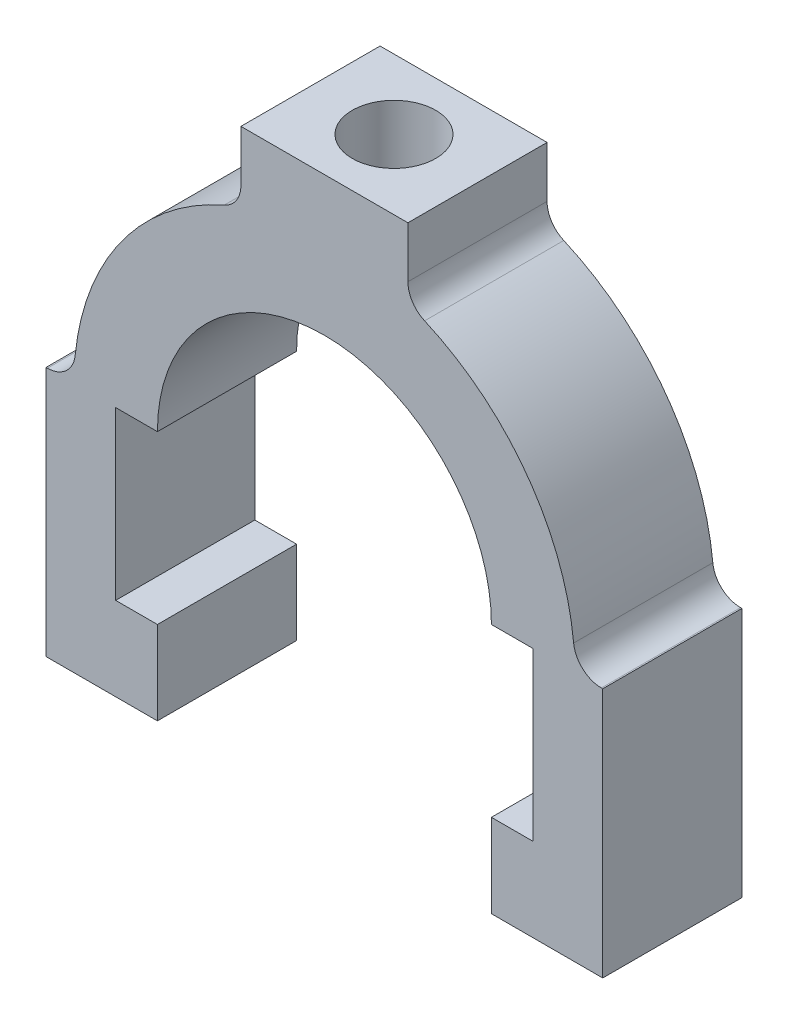
ISO-10303-21;
HEADER;
FILE_DESCRIPTION(('STEP AP214'),'2;1');
FILE_NAME('part.step','',(''),(''),'','','');
FILE_SCHEMA(('AUTOMOTIVE_DESIGN { 1 0 10303 214 1 1 1 1 }'));
ENDSEC;
DATA;
#1=APPLICATION_CONTEXT('core data for automotive mechanical design processes');
#2=APPLICATION_PROTOCOL_DEFINITION('international standard','automotive_design',2000,#1);
#3=PRODUCT_CONTEXT('',#1,'mechanical');
#4=PRODUCT('Part','Part','',(#3));
#5=PRODUCT_RELATED_PRODUCT_CATEGORY('part','',(#4));
#6=PRODUCT_DEFINITION_FORMATION('','',#4);
#7=PRODUCT_DEFINITION_CONTEXT('part definition',#1,'design');
#8=PRODUCT_DEFINITION('design','',#6,#7);
#9=PRODUCT_DEFINITION_SHAPE('','',#8);
#10=(LENGTH_UNIT() NAMED_UNIT(*) SI_UNIT(.MILLI.,.METRE.));
#11=(NAMED_UNIT(*) PLANE_ANGLE_UNIT() SI_UNIT($,.RADIAN.));
#12=(NAMED_UNIT(*) SI_UNIT($,.STERADIAN.) SOLID_ANGLE_UNIT());
#13=UNCERTAINTY_MEASURE_WITH_UNIT(LENGTH_MEASURE(1.E-05),#10,'distance_accuracy_value','');
#14=(GEOMETRIC_REPRESENTATION_CONTEXT(3) GLOBAL_UNCERTAINTY_ASSIGNED_CONTEXT((#13)) GLOBAL_UNIT_ASSIGNED_CONTEXT((#10,
#11,#12)) REPRESENTATION_CONTEXT('',''));
#15=CARTESIAN_POINT('',(0.,0.,0.));
#16=DIRECTION('',(0.,0.,1.));
#17=DIRECTION('',(1.,0.,0.));
#18=AXIS2_PLACEMENT_3D('',#15,#16,#17);
#19=CARTESIAN_POINT('',(0.,36.,10.));
#20=DIRECTION('',(0.,1.,0.));
#21=DIRECTION('',(0.,0.,1.));
#22=AXIS2_PLACEMENT_3D('',#19,#20,#21);
#23=PLANE('',#22);
#24=DIRECTION('',(1.,0.,0.));
#25=VECTOR('',#24,1.);
#26=CARTESIAN_POINT('',(0.,36.,-10.));
#27=LINE('',#26,#25);
#28=CARTESIAN_POINT('',(-16.,36.,-10.));
#29=VERTEX_POINT('',#28);
#30=CARTESIAN_POINT('',(-10.,36.,-10.));
#31=VERTEX_POINT('',#30);
#32=EDGE_CURVE('E230',#29,#31,#27,.T.);
#33=ORIENTED_EDGE('',*,*,#32,.T.);
#34=DIRECTION('',(0.,0.,-1.));
#35=VECTOR('',#34,1.);
#36=CARTESIAN_POINT('',(-10.,36.,10.));
#37=LINE('',#36,#35);
#38=CARTESIAN_POINT('',(-10.,36.,10.));
#39=VERTEX_POINT('',#38);
#40=EDGE_CURVE('E228',#39,#31,#37,.T.);
#41=ORIENTED_EDGE('',*,*,#40,.F.);
#42=DIRECTION('',(1.,0.,0.));
#43=VECTOR('',#42,1.);
#44=CARTESIAN_POINT('',(0.,36.,10.));
#45=LINE('',#44,#43);
#46=CARTESIAN_POINT('',(-16.,36.,10.));
#47=VERTEX_POINT('',#46);
#48=EDGE_CURVE('E212',#47,#39,#45,.T.);
#49=ORIENTED_EDGE('',*,*,#48,.F.);
#50=DIRECTION('',(0.,0.,-1.));
#51=VECTOR('',#50,1.);
#52=CARTESIAN_POINT('',(-16.,36.,10.));
#53=LINE('',#52,#51);
#54=EDGE_CURVE('E282',#47,#29,#53,.T.);
#55=ORIENTED_EDGE('',*,*,#54,.T.);
#56=EDGE_LOOP('',(#33,#41,#49,#55));
#57=FACE_BOUND('',#56,.T.);
#58=ADVANCED_FACE('F45',(#57),#23,.F.);
#59=CARTESIAN_POINT('',(-10.,0.,10.));
#60=DIRECTION('',(-1.,0.,0.));
#61=DIRECTION('',(0.,0.,1.));
#62=AXIS2_PLACEMENT_3D('',#59,#60,#61);
#63=PLANE('',#62);
#64=DIRECTION('',(0.,1.,0.));
#65=VECTOR('',#64,1.);
#66=CARTESIAN_POINT('',(-10.,0.,-10.));
#67=LINE('',#66,#65);
#68=CARTESIAN_POINT('',(-10.,12.,-10.));
#69=VERTEX_POINT('',#68);
#70=EDGE_CURVE('E284',#69,#31,#67,.T.);
#71=ORIENTED_EDGE('',*,*,#70,.F.);
#72=DIRECTION('',(0.,0.,-1.));
#73=VECTOR('',#72,1.);
#74=CARTESIAN_POINT('',(-10.,12.,10.));
#75=LINE('',#74,#73);
#76=CARTESIAN_POINT('',(-10.,12.,10.));
#77=VERTEX_POINT('',#76);
#78=EDGE_CURVE('E235',#77,#69,#75,.T.);
#79=ORIENTED_EDGE('',*,*,#78,.F.);
#80=DIRECTION('',(0.,1.,0.));
#81=VECTOR('',#80,1.);
#82=CARTESIAN_POINT('',(-10.,0.,10.));
#83=LINE('',#82,#81);
#84=EDGE_CURVE('E217',#77,#39,#83,.T.);
#85=ORIENTED_EDGE('',*,*,#84,.T.);
#86=ORIENTED_EDGE('',*,*,#40,.T.);
#87=EDGE_LOOP('',(#71,#79,#85,#86));
#88=FACE_BOUND('',#87,.T.);
#89=ADVANCED_FACE('F237',(#88),#63,.T.);
#90=CARTESIAN_POINT('',(0.,12.,10.));
#91=DIRECTION('',(0.,1.,0.));
#92=DIRECTION('',(0.,0.,1.));
#93=AXIS2_PLACEMENT_3D('',#90,#91,#92);
#94=PLANE('',#93);
#95=DIRECTION('',(1.,0.,0.));
#96=VECTOR('',#95,1.);
#97=CARTESIAN_POINT('',(0.,12.,-10.));
#98=LINE('',#97,#96);
#99=CARTESIAN_POINT('',(-16.,12.,-10.));
#100=VERTEX_POINT('',#99);
#101=EDGE_CURVE('E286',#100,#69,#98,.T.);
#102=ORIENTED_EDGE('',*,*,#101,.F.);
#103=DIRECTION('',(0.,0.,-1.));
#104=VECTOR('',#103,1.);
#105=CARTESIAN_POINT('',(-16.,12.,10.));
#106=LINE('',#105,#104);
#107=CARTESIAN_POINT('',(-16.,12.,10.));
#108=VERTEX_POINT('',#107);
#109=EDGE_CURVE('E359',#108,#100,#106,.T.);
#110=ORIENTED_EDGE('',*,*,#109,.F.);
#111=DIRECTION('',(1.,0.,0.));
#112=VECTOR('',#111,1.);
#113=CARTESIAN_POINT('',(0.,12.,10.));
#114=LINE('',#113,#112);
#115=EDGE_CURVE('E238',#108,#77,#114,.T.);
#116=ORIENTED_EDGE('',*,*,#115,.T.);
#117=ORIENTED_EDGE('',*,*,#78,.T.);
#118=EDGE_LOOP('',(#102,#110,#116,#117));
#119=FACE_BOUND('',#118,.T.);
#120=ADVANCED_FACE('F456',(#119),#94,.T.);
#121=CARTESIAN_POINT('',(-16.,0.,10.));
#122=DIRECTION('',(-1.,0.,0.));
#123=DIRECTION('',(0.,0.,1.));
#124=AXIS2_PLACEMENT_3D('',#121,#122,#123);
#125=PLANE('',#124);
#126=DIRECTION('',(0.,1.,0.));
#127=VECTOR('',#126,1.);
#128=CARTESIAN_POINT('',(-16.,0.,-10.));
#129=LINE('',#128,#127);
#130=CARTESIAN_POINT('',(-16.,0.,-10.));
#131=VERTEX_POINT('',#130);
#132=EDGE_CURVE('E289',#131,#100,#129,.T.);
#133=ORIENTED_EDGE('',*,*,#132,.F.);
#134=DIRECTION('',(0.,0.,-1.));
#135=VECTOR('',#134,1.);
#136=CARTESIAN_POINT('',(-16.,0.,10.));
#137=LINE('',#136,#135);
#138=CARTESIAN_POINT('',(-16.,0.,10.));
#139=VERTEX_POINT('',#138);
#140=EDGE_CURVE('E357',#139,#131,#137,.T.);
#141=ORIENTED_EDGE('',*,*,#140,.F.);
#142=DIRECTION('',(0.,1.,0.));
#143=VECTOR('',#142,1.);
#144=CARTESIAN_POINT('',(-16.,0.,10.));
#145=LINE('',#144,#143);
#146=EDGE_CURVE('E240',#139,#108,#145,.T.);
#147=ORIENTED_EDGE('',*,*,#146,.T.);
#148=ORIENTED_EDGE('',*,*,#109,.T.);
#149=EDGE_LOOP('',(#133,#141,#147,#148));
#150=FACE_BOUND('',#149,.T.);
#151=ADVANCED_FACE('F453',(#150),#125,.T.);
#152=CARTESIAN_POINT('',(0.,0.,10.));
#153=DIRECTION('',(0.,-1.,0.));
#154=DIRECTION('',(1.,0.,0.));
#155=AXIS2_PLACEMENT_3D('',#152,#153,#154);
#156=PLANE('',#155);
#157=DIRECTION('',(-1.,0.,0.));
#158=VECTOR('',#157,1.);
#159=CARTESIAN_POINT('',(0.,0.,-10.));
#160=LINE('',#159,#158);
#161=CARTESIAN_POINT('',(0.,0.,-10.));
#162=VERTEX_POINT('',#161);
#163=EDGE_CURVE('E292',#162,#131,#160,.T.);
#164=ORIENTED_EDGE('',*,*,#163,.F.);
#165=DIRECTION('',(0.,0.,-1.));
#166=VECTOR('',#165,1.);
#167=CARTESIAN_POINT('',(0.,0.,10.));
#168=LINE('',#167,#166);
#169=CARTESIAN_POINT('',(0.,0.,10.));
#170=VERTEX_POINT('',#169);
#171=EDGE_CURVE('E355',#170,#162,#168,.T.);
#172=ORIENTED_EDGE('',*,*,#171,.F.);
#173=DIRECTION('',(-1.,0.,0.));
#174=VECTOR('',#173,1.);
#175=CARTESIAN_POINT('',(0.,0.,10.));
#176=LINE('',#175,#174);
#177=EDGE_CURVE('E246',#170,#139,#176,.T.);
#178=ORIENTED_EDGE('',*,*,#177,.T.);
#179=ORIENTED_EDGE('',*,*,#140,.T.);
#180=EDGE_LOOP('',(#164,#172,#178,#179));
#181=FACE_BOUND('',#180,.T.);
#182=ADVANCED_FACE('F448',(#181),#156,.T.);
#183=CARTESIAN_POINT('',(0.,0.,10.));
#184=DIRECTION('',(-1.,0.,0.));
#185=DIRECTION('',(0.,0.,1.));
#186=AXIS2_PLACEMENT_3D('',#183,#184,#185);
#187=PLANE('',#186);
#188=DIRECTION('',(0.,1.,0.));
#189=VECTOR('',#188,1.);
#190=CARTESIAN_POINT('',(0.,0.,-10.));
#191=LINE('',#190,#189);
#192=CARTESIAN_POINT('',(0.,36.,-10.));
#193=VERTEX_POINT('',#192);
#194=EDGE_CURVE('E295',#162,#193,#191,.T.);
#195=ORIENTED_EDGE('',*,*,#194,.T.);
#196=DIRECTION('',(0.,0.,-1.));
#197=VECTOR('',#196,1.);
#198=CARTESIAN_POINT('',(0.,36.,10.));
#199=LINE('',#198,#197);
#200=CARTESIAN_POINT('',(0.,36.,10.));
#201=VERTEX_POINT('',#200);
#202=EDGE_CURVE('E352',#201,#193,#199,.T.);
#203=ORIENTED_EDGE('',*,*,#202,.F.);
#204=DIRECTION('',(0.,1.,0.));
#205=VECTOR('',#204,1.);
#206=CARTESIAN_POINT('',(0.,0.,10.));
#207=LINE('',#206,#205);
#208=EDGE_CURVE('E249',#170,#201,#207,.T.);
#209=ORIENTED_EDGE('',*,*,#208,.F.);
#210=ORIENTED_EDGE('',*,*,#171,.T.);
#211=EDGE_LOOP('',(#195,#203,#209,#210));
#212=FACE_BOUND('',#211,.T.);
#213=ADVANCED_FACE('F445',(#212),#187,.F.);
#214=CARTESIAN_POINT('',(0.,36.,10.));
#215=DIRECTION('',(0.,1.,0.));
#216=DIRECTION('',(0.,0.,1.));
#217=AXIS2_PLACEMENT_3D('',#214,#215,#216);
#218=PLANE('',#217);
#219=DIRECTION('',(1.,0.,0.));
#220=VECTOR('',#219,1.);
#221=CARTESIAN_POINT('',(0.,36.,-10.));
#222=LINE('',#221,#220);
#223=CARTESIAN_POINT('',(-0.200502515735196,36.,-10.));
#224=VERTEX_POINT('',#223);
#225=EDGE_CURVE('E298',#224,#193,#222,.T.);
#226=ORIENTED_EDGE('',*,*,#225,.F.);
#227=DIRECTION('',(0.,0.,-1.));
#228=VECTOR('',#227,1.);
#229=CARTESIAN_POINT('',(-0.200502515735196,36.,10.));
#230=LINE('',#229,#228);
#231=CARTESIAN_POINT('',(-0.200502515735196,36.,10.));
#232=VERTEX_POINT('',#231);
#233=EDGE_CURVE('E375',#224,#232,#230,.F.);
#234=ORIENTED_EDGE('',*,*,#233,.T.);
#235=DIRECTION('',(1.,0.,0.));
#236=VECTOR('',#235,1.);
#237=CARTESIAN_POINT('',(0.,36.,10.));
#238=LINE('',#237,#236);
#239=EDGE_CURVE('E252',#232,#201,#238,.T.);
#240=ORIENTED_EDGE('',*,*,#239,.T.);
#241=ORIENTED_EDGE('',*,*,#202,.T.);
#242=EDGE_LOOP('',(#226,#234,#240,#241));
#243=FACE_BOUND('',#242,.T.);
#244=ADVANCED_FACE('F440',(#243),#218,.T.);
#245=CARTESIAN_POINT('',(-40.,36.,10.));
#246=DIRECTION('',(0.,0.,-1.));
#247=DIRECTION('',(-1.,0.,0.));
#248=AXIS2_PLACEMENT_3D('',#245,#246,#247);
#249=CYLINDRICAL_SURFACE('',#248,36.);
#250=CARTESIAN_POINT('',(-40.,36.,10.));
#251=DIRECTION('',(0.,0.,1.));
#252=DIRECTION('',(1.,0.,0.));
#253=AXIS2_PLACEMENT_3D('',#250,#251,#252);
#254=CIRCLE('',#253,36.);
#255=CARTESIAN_POINT('',(-4.18045226416168,39.6,10.));
#256=VERTEX_POINT('',#255);
#257=CARTESIAN_POINT('',(-25.6,68.994545003682,10.));
#258=VERTEX_POINT('',#257);
#259=EDGE_CURVE('E254',#256,#258,#254,.T.);
#260=ORIENTED_EDGE('',*,*,#259,.F.);
#261=DIRECTION('',(0.,0.,-1.));
#262=VECTOR('',#261,1.);
#263=CARTESIAN_POINT('',(-4.18045226416168,39.6,10.));
#264=LINE('',#263,#262);
#265=CARTESIAN_POINT('',(-4.18045226416168,39.6,-10.));
#266=VERTEX_POINT('',#265);
#267=EDGE_CURVE('E372',#256,#266,#264,.T.);
#268=ORIENTED_EDGE('',*,*,#267,.T.);
#269=CARTESIAN_POINT('',(-40.,36.,-10.));
#270=DIRECTION('',(0.,0.,1.));
#271=DIRECTION('',(1.,0.,0.));
#272=AXIS2_PLACEMENT_3D('',#269,#270,#271);
#273=CIRCLE('',#272,36.);
#274=CARTESIAN_POINT('',(-25.6,68.994545003682,-10.));
#275=VERTEX_POINT('',#274);
#276=EDGE_CURVE('E300',#266,#275,#273,.T.);
#277=ORIENTED_EDGE('',*,*,#276,.T.);
#278=DIRECTION('',(0.,0.,-1.));
#279=VECTOR('',#278,1.);
#280=CARTESIAN_POINT('',(-25.6,68.994545003682,10.));
#281=LINE('',#280,#279);
#282=EDGE_CURVE('E364',#275,#258,#281,.F.);
#283=ORIENTED_EDGE('',*,*,#282,.T.);
#284=EDGE_LOOP('',(#260,#268,#277,#283));
#285=FACE_BOUND('',#284,.T.);
#286=ADVANCED_FACE('F431',(#285),#249,.T.);
#287=CARTESIAN_POINT('',(-28.,0.,10.));
#288=DIRECTION('',(1.,0.,0.));
#289=DIRECTION('',(0.,1.,0.));
#290=AXIS2_PLACEMENT_3D('',#287,#288,#289);
#291=PLANE('',#290);
#292=DIRECTION('',(0.,-1.,0.));
#293=VECTOR('',#292,1.);
#294=CARTESIAN_POINT('',(-28.,0.,10.));
#295=LINE('',#294,#293);
#296=CARTESIAN_POINT('',(-28.,80.,10.));
#297=VERTEX_POINT('',#296);
#298=CARTESIAN_POINT('',(-28.,72.6606055596467,10.));
#299=VERTEX_POINT('',#298);
#300=EDGE_CURVE('E256',#297,#299,#295,.T.);
#301=ORIENTED_EDGE('',*,*,#300,.T.);
#302=DIRECTION('',(0.,0.,-1.));
#303=VECTOR('',#302,1.);
#304=CARTESIAN_POINT('',(-28.,72.6606055596467,10.));
#305=LINE('',#304,#303);
#306=CARTESIAN_POINT('',(-28.,72.6606055596467,-10.));
#307=VERTEX_POINT('',#306);
#308=EDGE_CURVE('E234',#299,#307,#305,.T.);
#309=ORIENTED_EDGE('',*,*,#308,.T.);
#310=DIRECTION('',(0.,-1.,0.));
#311=VECTOR('',#310,1.);
#312=CARTESIAN_POINT('',(-28.,0.,-10.));
#313=LINE('',#312,#311);
#314=CARTESIAN_POINT('',(-28.,80.,-10.));
#315=VERTEX_POINT('',#314);
#316=EDGE_CURVE('E302',#315,#307,#313,.T.);
#317=ORIENTED_EDGE('',*,*,#316,.F.);
#318=DIRECTION('',(0.,0.,-1.));
#319=VECTOR('',#318,1.);
#320=CARTESIAN_POINT('',(-28.,80.,10.));
#321=LINE('',#320,#319);
#322=EDGE_CURVE('E350',#297,#315,#321,.T.);
#323=ORIENTED_EDGE('',*,*,#322,.F.);
#324=EDGE_LOOP('',(#301,#309,#317,#323));
#325=FACE_BOUND('',#324,.T.);
#326=ADVANCED_FACE('F422',(#325),#291,.T.);
#327=CARTESIAN_POINT('',(0.,80.,10.));
#328=DIRECTION('',(0.,1.,0.));
#329=DIRECTION('',(-1.,0.,0.));
#330=AXIS2_PLACEMENT_3D('',#327,#328,#329);
#331=PLANE('',#330);
#332=CARTESIAN_POINT('',(-40.,80.,0.));
#333=DIRECTION('',(0.,1.,0.));
#334=DIRECTION('',(0.,0.,1.));
#335=AXIS2_PLACEMENT_3D('',#332,#333,#334);
#336=CIRCLE('',#335,6.);
#337=CARTESIAN_POINT('',(-40.,80.,6.));
#338=VERTEX_POINT('',#337);
#339=EDGE_CURVE('E720',#338,#338,#336,.T.);
#340=ORIENTED_EDGE('',*,*,#339,.F.);
#341=EDGE_LOOP('',(#340));
#342=FACE_BOUND('',#341,.T.);
#343=DIRECTION('',(1.,0.,0.));
#344=VECTOR('',#343,1.);
#345=CARTESIAN_POINT('',(0.,80.,-10.));
#346=LINE('',#345,#344);
#347=CARTESIAN_POINT('',(-52.,80.,-10.));
#348=VERTEX_POINT('',#347);
#349=EDGE_CURVE('E306',#348,#315,#346,.T.);
#350=ORIENTED_EDGE('',*,*,#349,.F.);
#351=DIRECTION('',(0.,0.,-1.));
#352=VECTOR('',#351,1.);
#353=CARTESIAN_POINT('',(-52.,80.,10.));
#354=LINE('',#353,#352);
#355=CARTESIAN_POINT('',(-52.,80.,10.));
#356=VERTEX_POINT('',#355);
#357=EDGE_CURVE('E348',#356,#348,#354,.T.);
#358=ORIENTED_EDGE('',*,*,#357,.F.);
#359=DIRECTION('',(1.,0.,0.));
#360=VECTOR('',#359,1.);
#361=CARTESIAN_POINT('',(0.,80.,10.));
#362=LINE('',#361,#360);
#363=EDGE_CURVE('E260',#356,#297,#362,.T.);
#364=ORIENTED_EDGE('',*,*,#363,.T.);
#365=ORIENTED_EDGE('',*,*,#322,.T.);
#366=EDGE_LOOP('',(#350,#358,#364,#365));
#367=FACE_BOUND('',#366,.T.);
#368=ADVANCED_FACE('F419',(#342,#367),#331,.T.);
#369=CARTESIAN_POINT('',(-52.,0.,10.));
#370=DIRECTION('',(1.,0.,0.));
#371=DIRECTION('',(0.,0.,-1.));
#372=AXIS2_PLACEMENT_3D('',#369,#370,#371);
#373=PLANE('',#372);
#374=DIRECTION('',(0.,-1.,0.));
#375=VECTOR('',#374,1.);
#376=CARTESIAN_POINT('',(-52.,0.,-10.));
#377=LINE('',#376,#375);
#378=CARTESIAN_POINT('',(-52.,72.6606055596467,-10.));
#379=VERTEX_POINT('',#378);
#380=EDGE_CURVE('E309',#348,#379,#377,.T.);
#381=ORIENTED_EDGE('',*,*,#380,.T.);
#382=DIRECTION('',(0.,0.,1.));
#383=VECTOR('',#382,1.);
#384=CARTESIAN_POINT('',(-52.,72.6606055596467,10.));
#385=LINE('',#384,#383);
#386=CARTESIAN_POINT('',(-52.,72.6606055596467,10.));
#387=VERTEX_POINT('',#386);
#388=EDGE_CURVE('E66',#379,#387,#385,.T.);
#389=ORIENTED_EDGE('',*,*,#388,.T.);
#390=DIRECTION('',(0.,-1.,0.));
#391=VECTOR('',#390,1.);
#392=CARTESIAN_POINT('',(-52.,0.,10.));
#393=LINE('',#392,#391);
#394=EDGE_CURVE('E263',#356,#387,#393,.T.);
#395=ORIENTED_EDGE('',*,*,#394,.F.);
#396=ORIENTED_EDGE('',*,*,#357,.T.);
#397=EDGE_LOOP('',(#381,#389,#395,#396));
#398=FACE_BOUND('',#397,.T.);
#399=ADVANCED_FACE('F416',(#398),#373,.F.);
#400=CARTESIAN_POINT('',(-54.4,68.994545003682,-10.));
#401=VERTEX_POINT('',#400);
#402=CARTESIAN_POINT('',(-75.8195477358383,39.6,-10.));
#403=VERTEX_POINT('',#402);
#404=EDGE_CURVE('E303',#401,#403,#273,.T.);
#405=ORIENTED_EDGE('',*,*,#404,.T.);
#406=DIRECTION('',(0.,0.,-1.));
#407=VECTOR('',#406,1.);
#408=CARTESIAN_POINT('',(-75.8195477358383,39.6,10.));
#409=LINE('',#408,#407);
#410=CARTESIAN_POINT('',(-75.8195477358383,39.6,10.));
#411=VERTEX_POINT('',#410);
#412=EDGE_CURVE('E387',#403,#411,#409,.F.);
#413=ORIENTED_EDGE('',*,*,#412,.T.);
#414=CARTESIAN_POINT('',(-54.4,68.994545003682,10.));
#415=VERTEX_POINT('',#414);
#416=EDGE_CURVE('E257',#415,#411,#254,.T.);
#417=ORIENTED_EDGE('',*,*,#416,.F.);
#418=DIRECTION('',(0.,0.,-1.));
#419=VECTOR('',#418,1.);
#420=CARTESIAN_POINT('',(-54.4,68.9945450036821,10.));
#421=LINE('',#420,#419);
#422=EDGE_CURVE('E384',#415,#401,#421,.T.);
#423=ORIENTED_EDGE('',*,*,#422,.T.);
#424=EDGE_LOOP('',(#405,#413,#417,#423));
#425=FACE_BOUND('',#424,.T.);
#426=ADVANCED_FACE('F410',(#425),#249,.T.);
#427=CARTESIAN_POINT('',(0.,36.,10.));
#428=DIRECTION('',(0.,-1.,0.));
#429=DIRECTION('',(0.,0.,-1.));
#430=AXIS2_PLACEMENT_3D('',#427,#428,#429);
#431=PLANE('',#430);
#432=DIRECTION('',(-1.,0.,0.));
#433=VECTOR('',#432,1.);
#434=CARTESIAN_POINT('',(0.,36.,10.));
#435=LINE('',#434,#433);
#436=CARTESIAN_POINT('',(-79.7994974842648,36.,10.));
#437=VERTEX_POINT('',#436);
#438=CARTESIAN_POINT('',(-80.,36.,10.));
#439=VERTEX_POINT('',#438);
#440=EDGE_CURVE('E265',#437,#439,#435,.T.);
#441=ORIENTED_EDGE('',*,*,#440,.F.);
#442=DIRECTION('',(0.,0.,1.));
#443=VECTOR('',#442,1.);
#444=CARTESIAN_POINT('',(-79.7994974842648,36.,-10.));
#445=LINE('',#444,#443);
#446=CARTESIAN_POINT('',(-79.7994974842648,36.,-10.));
#447=VERTEX_POINT('',#446);
#448=EDGE_CURVE('E381',#437,#447,#445,.F.);
#449=ORIENTED_EDGE('',*,*,#448,.T.);
#450=DIRECTION('',(-1.,0.,0.));
#451=VECTOR('',#450,1.);
#452=CARTESIAN_POINT('',(0.,36.,-10.));
#453=LINE('',#452,#451);
#454=CARTESIAN_POINT('',(-80.,36.,-10.));
#455=VERTEX_POINT('',#454);
#456=EDGE_CURVE('E311',#447,#455,#453,.T.);
#457=ORIENTED_EDGE('',*,*,#456,.T.);
#458=DIRECTION('',(0.,0.,-1.));
#459=VECTOR('',#458,1.);
#460=CARTESIAN_POINT('',(-80.,36.,10.));
#461=LINE('',#460,#459);
#462=EDGE_CURVE('E345',#439,#455,#461,.T.);
#463=ORIENTED_EDGE('',*,*,#462,.F.);
#464=EDGE_LOOP('',(#441,#449,#457,#463));
#465=FACE_BOUND('',#464,.T.);
#466=ADVANCED_FACE('F404',(#465),#431,.F.);
#467=CARTESIAN_POINT('',(-80.,0.,10.));
#468=DIRECTION('',(-1.,0.,0.));
#469=DIRECTION('',(0.,0.,1.));
#470=AXIS2_PLACEMENT_3D('',#467,#468,#469);
#471=PLANE('',#470);
#472=DIRECTION('',(0.,1.,0.));
#473=VECTOR('',#472,1.);
#474=CARTESIAN_POINT('',(-80.,0.,-10.));
#475=LINE('',#474,#473);
#476=CARTESIAN_POINT('',(-80.,0.,-10.));
#477=VERTEX_POINT('',#476);
#478=EDGE_CURVE('E313',#477,#455,#475,.T.);
#479=ORIENTED_EDGE('',*,*,#478,.F.);
#480=DIRECTION('',(0.,0.,-1.));
#481=VECTOR('',#480,1.);
#482=CARTESIAN_POINT('',(-80.,0.,10.));
#483=LINE('',#482,#481);
#484=CARTESIAN_POINT('',(-80.,0.,10.));
#485=VERTEX_POINT('',#484);
#486=EDGE_CURVE('E343',#485,#477,#483,.T.);
#487=ORIENTED_EDGE('',*,*,#486,.F.);
#488=DIRECTION('',(0.,1.,0.));
#489=VECTOR('',#488,1.);
#490=CARTESIAN_POINT('',(-80.,0.,10.));
#491=LINE('',#490,#489);
#492=EDGE_CURVE('E267',#485,#439,#491,.T.);
#493=ORIENTED_EDGE('',*,*,#492,.T.);
#494=ORIENTED_EDGE('',*,*,#462,.T.);
#495=EDGE_LOOP('',(#479,#487,#493,#494));
#496=FACE_BOUND('',#495,.T.);
#497=ADVANCED_FACE('F516',(#496),#471,.T.);
#498=CARTESIAN_POINT('',(0.,0.,10.));
#499=DIRECTION('',(0.,1.,0.));
#500=DIRECTION('',(0.,0.,1.));
#501=AXIS2_PLACEMENT_3D('',#498,#499,#500);
#502=PLANE('',#501);
#503=DIRECTION('',(1.,0.,0.));
#504=VECTOR('',#503,1.);
#505=CARTESIAN_POINT('',(0.,0.,-10.));
#506=LINE('',#505,#504);
#507=CARTESIAN_POINT('',(-64.,0.,-10.));
#508=VERTEX_POINT('',#507);
#509=EDGE_CURVE('E316',#477,#508,#506,.T.);
#510=ORIENTED_EDGE('',*,*,#509,.T.);
#511=DIRECTION('',(0.,0.,-1.));
#512=VECTOR('',#511,1.);
#513=CARTESIAN_POINT('',(-64.,0.,10.));
#514=LINE('',#513,#512);
#515=CARTESIAN_POINT('',(-64.,0.,10.));
#516=VERTEX_POINT('',#515);
#517=EDGE_CURVE('E340',#516,#508,#514,.T.);
#518=ORIENTED_EDGE('',*,*,#517,.F.);
#519=DIRECTION('',(1.,0.,0.));
#520=VECTOR('',#519,1.);
#521=CARTESIAN_POINT('',(0.,0.,10.));
#522=LINE('',#521,#520);
#523=EDGE_CURVE('E270',#485,#516,#522,.T.);
#524=ORIENTED_EDGE('',*,*,#523,.F.);
#525=ORIENTED_EDGE('',*,*,#486,.T.);
#526=EDGE_LOOP('',(#510,#518,#524,#525));
#527=FACE_BOUND('',#526,.T.);
#528=ADVANCED_FACE('F512',(#527),#502,.F.);
#529=CARTESIAN_POINT('',(-64.,0.,10.));
#530=DIRECTION('',(-1.,0.,0.));
#531=DIRECTION('',(0.,0.,1.));
#532=AXIS2_PLACEMENT_3D('',#529,#530,#531);
#533=PLANE('',#532);
#534=DIRECTION('',(0.,1.,0.));
#535=VECTOR('',#534,1.);
#536=CARTESIAN_POINT('',(-64.,0.,-10.));
#537=LINE('',#536,#535);
#538=CARTESIAN_POINT('',(-64.,12.,-10.));
#539=VERTEX_POINT('',#538);
#540=EDGE_CURVE('E318',#508,#539,#537,.T.);
#541=ORIENTED_EDGE('',*,*,#540,.T.);
#542=DIRECTION('',(0.,0.,-1.));
#543=VECTOR('',#542,1.);
#544=CARTESIAN_POINT('',(-64.,12.,10.));
#545=LINE('',#544,#543);
#546=CARTESIAN_POINT('',(-64.,12.,10.));
#547=VERTEX_POINT('',#546);
#548=EDGE_CURVE('E337',#547,#539,#545,.T.);
#549=ORIENTED_EDGE('',*,*,#548,.F.);
#550=DIRECTION('',(0.,1.,0.));
#551=VECTOR('',#550,1.);
#552=CARTESIAN_POINT('',(-64.,0.,10.));
#553=LINE('',#552,#551);
#554=EDGE_CURVE('E272',#516,#547,#553,.T.);
#555=ORIENTED_EDGE('',*,*,#554,.F.);
#556=ORIENTED_EDGE('',*,*,#517,.T.);
#557=EDGE_LOOP('',(#541,#549,#555,#556));
#558=FACE_BOUND('',#557,.T.);
#559=ADVANCED_FACE('F508',(#558),#533,.F.);
#560=CARTESIAN_POINT('',(0.,12.,10.));
#561=DIRECTION('',(0.,-1.,0.));
#562=DIRECTION('',(0.,0.,-1.));
#563=AXIS2_PLACEMENT_3D('',#560,#561,#562);
#564=PLANE('',#563);
#565=DIRECTION('',(-1.,0.,0.));
#566=VECTOR('',#565,1.);
#567=CARTESIAN_POINT('',(0.,12.,-10.));
#568=LINE('',#567,#566);
#569=CARTESIAN_POINT('',(-70.,12.,-10.));
#570=VERTEX_POINT('',#569);
#571=EDGE_CURVE('E320',#539,#570,#568,.T.);
#572=ORIENTED_EDGE('',*,*,#571,.T.);
#573=DIRECTION('',(0.,0.,-1.));
#574=VECTOR('',#573,1.);
#575=CARTESIAN_POINT('',(-70.,12.,10.));
#576=LINE('',#575,#574);
#577=CARTESIAN_POINT('',(-70.,12.,10.));
#578=VERTEX_POINT('',#577);
#579=EDGE_CURVE('E334',#578,#570,#576,.T.);
#580=ORIENTED_EDGE('',*,*,#579,.F.);
#581=DIRECTION('',(-1.,0.,0.));
#582=VECTOR('',#581,1.);
#583=CARTESIAN_POINT('',(0.,12.,10.));
#584=LINE('',#583,#582);
#585=EDGE_CURVE('E274',#547,#578,#584,.T.);
#586=ORIENTED_EDGE('',*,*,#585,.F.);
#587=ORIENTED_EDGE('',*,*,#548,.T.);
#588=EDGE_LOOP('',(#572,#580,#586,#587));
#589=FACE_BOUND('',#588,.T.);
#590=ADVANCED_FACE('F504',(#589),#564,.F.);
#591=CARTESIAN_POINT('',(-70.,0.,10.));
#592=DIRECTION('',(-1.,0.,0.));
#593=DIRECTION('',(0.,0.,1.));
#594=AXIS2_PLACEMENT_3D('',#591,#592,#593);
#595=PLANE('',#594);
#596=DIRECTION('',(0.,1.,0.));
#597=VECTOR('',#596,1.);
#598=CARTESIAN_POINT('',(-70.,0.,-10.));
#599=LINE('',#598,#597);
#600=CARTESIAN_POINT('',(-70.,36.,-10.));
#601=VERTEX_POINT('',#600);
#602=EDGE_CURVE('E322',#570,#601,#599,.T.);
#603=ORIENTED_EDGE('',*,*,#602,.T.);
#604=DIRECTION('',(0.,0.,-1.));
#605=VECTOR('',#604,1.);
#606=CARTESIAN_POINT('',(-70.,36.,10.));
#607=LINE('',#606,#605);
#608=CARTESIAN_POINT('',(-70.,36.,10.));
#609=VERTEX_POINT('',#608);
#610=EDGE_CURVE('E332',#609,#601,#607,.T.);
#611=ORIENTED_EDGE('',*,*,#610,.F.);
#612=DIRECTION('',(0.,1.,0.));
#613=VECTOR('',#612,1.);
#614=CARTESIAN_POINT('',(-70.,0.,10.));
#615=LINE('',#614,#613);
#616=EDGE_CURVE('E276',#578,#609,#615,.T.);
#617=ORIENTED_EDGE('',*,*,#616,.F.);
#618=ORIENTED_EDGE('',*,*,#579,.T.);
#619=EDGE_LOOP('',(#603,#611,#617,#618));
#620=FACE_BOUND('',#619,.T.);
#621=ADVANCED_FACE('F500',(#620),#595,.F.);
#622=CARTESIAN_POINT('',(0.,36.,10.));
#623=DIRECTION('',(0.,-1.,0.));
#624=DIRECTION('',(0.,0.,-1.));
#625=AXIS2_PLACEMENT_3D('',#622,#623,#624);
#626=PLANE('',#625);
#627=DIRECTION('',(-1.,0.,0.));
#628=VECTOR('',#627,1.);
#629=CARTESIAN_POINT('',(0.,36.,-10.));
#630=LINE('',#629,#628);
#631=CARTESIAN_POINT('',(-64.,36.,-10.));
#632=VERTEX_POINT('',#631);
#633=EDGE_CURVE('E325',#632,#601,#630,.T.);
#634=ORIENTED_EDGE('',*,*,#633,.F.);
#635=DIRECTION('',(0.,0.,-1.));
#636=VECTOR('',#635,1.);
#637=CARTESIAN_POINT('',(-64.,36.,10.));
#638=LINE('',#637,#636);
#639=CARTESIAN_POINT('',(-64.,36.,10.));
#640=VERTEX_POINT('',#639);
#641=EDGE_CURVE('E330',#640,#632,#638,.T.);
#642=ORIENTED_EDGE('',*,*,#641,.F.);
#643=DIRECTION('',(-1.,0.,0.));
#644=VECTOR('',#643,1.);
#645=CARTESIAN_POINT('',(0.,36.,10.));
#646=LINE('',#645,#644);
#647=EDGE_CURVE('E278',#640,#609,#646,.T.);
#648=ORIENTED_EDGE('',*,*,#647,.T.);
#649=ORIENTED_EDGE('',*,*,#610,.T.);
#650=EDGE_LOOP('',(#634,#642,#648,#649));
#651=FACE_BOUND('',#650,.T.);
#652=ADVANCED_FACE('F496',(#651),#626,.T.);
#653=CARTESIAN_POINT('',(-40.,36.,10.));
#654=DIRECTION('',(0.,0.,-1.));
#655=DIRECTION('',(-1.,0.,0.));
#656=AXIS2_PLACEMENT_3D('',#653,#654,#655);
#657=CYLINDRICAL_SURFACE('',#656,24.);
#658=CARTESIAN_POINT('',(-40.,60.,6.));
#659=CARTESIAN_POINT('',(-39.8341946125962,60.0000029962766,6.00000494897359));
#660=CARTESIAN_POINT('',(-39.6684433819042,59.9982792337243,5.99312612510758));
#661=CARTESIAN_POINT('',(-39.3381016585003,59.9914389070726,5.96568013798363));
#662=CARTESIAN_POINT('',(-39.1735113003878,59.9863219558732,5.94511141295985));
#663=CARTESIAN_POINT('',(-38.8466853171057,59.9728312747808,5.89044428060452));
#664=CARTESIAN_POINT('',(-38.6844504386397,59.964456534561,5.85634167599155));
#665=CARTESIAN_POINT('',(-38.3634700064661,59.9446785682942,5.77487607210351));
#666=CARTESIAN_POINT('',(-38.2047257620827,59.9332742261501,5.72750818558487));
#667=CARTESIAN_POINT('',(-37.8921410917286,59.9077704080524,5.61998280172962));
#668=CARTESIAN_POINT('',(-37.738293250365,59.8936752583917,5.55984581741775));
#669=CARTESIAN_POINT('',(-37.4362137617874,59.8631527081916,5.42717458978424));
#670=CARTESIAN_POINT('',(-37.287984212872,59.8467244469549,5.35463576933752));
#671=CARTESIAN_POINT('',(-36.9982233896646,59.8119848981805,5.19773725487093));
#672=CARTESIAN_POINT('',(-36.8566897030637,59.7936742964516,5.11338186204822));
#673=CARTESIAN_POINT('',(-36.5811147334551,59.7556431475739,4.93338823540961));
#674=CARTESIAN_POINT('',(-36.4470762946551,59.7359220715781,4.8377457607558));
#675=CARTESIAN_POINT('',(-36.1850356539762,59.6952304700178,4.63401408275085));
#676=CARTESIAN_POINT('',(-36.0571869108679,59.674243775966,4.52573068744439));
#677=CARTESIAN_POINT('',(-35.8109726315832,59.6319204183454,4.29884696688901));
#678=CARTESIAN_POINT('',(-35.6926106315304,59.6105836278175,4.1802428286891));
#679=CARTESIAN_POINT('',(-35.4662251047599,59.5681596204781,3.93356111670132));
#680=CARTESIAN_POINT('',(-35.3581989681451,59.5470723418473,3.80548594899046));
#681=CARTESIAN_POINT('',(-35.1531368370016,59.5057198367545,3.54061858346323));
#682=CARTESIAN_POINT('',(-35.0561049144283,59.4854549166434,3.40382318503403));
#683=CARTESIAN_POINT('',(-34.8724242066577,59.4460427828086,3.12039938605442));
#684=CARTESIAN_POINT('',(-34.7859467092673,59.4269160793509,2.97365702103662));
#685=CARTESIAN_POINT('',(-34.6256590076093,59.3906650895731,2.67310368885841));
#686=CARTESIAN_POINT('',(-34.5518535945897,59.3735415614194,2.51929007584012));
#687=CARTESIAN_POINT('',(-34.4175618303795,59.3418328254504,2.20577119001699));
#688=CARTESIAN_POINT('',(-34.3570688729993,59.3272463593972,2.04606888557205));
#689=CARTESIAN_POINT('',(-34.249837439393,59.301043510543,1.72187701093291));
#690=CARTESIAN_POINT('',(-34.2031038886888,59.2894281915328,1.5573857495113));
#691=CARTESIAN_POINT('',(-34.0858484268333,59.2600431044562,1.06517830741339));
#692=CARTESIAN_POINT('',(-34.0354101390768,59.2470332112981,0.732016382923851));
#693=CARTESIAN_POINT('',(-34.002041516504,59.23842608856,0.229851548639674));
#694=CARTESIAN_POINT('',(-33.9979733638605,59.2373766993858,0.0619945228304873));
#695=CARTESIAN_POINT('',(-34.0038902919923,59.2389046091482,-0.273475649155788));
#696=CARTESIAN_POINT('',(-34.0138755117726,59.2414819439575,-0.44108879290417));
#697=CARTESIAN_POINT('',(-34.0640528652541,59.2543754061852,-0.933475761770903));
#698=CARTESIAN_POINT('',(-34.1239263615168,59.2697164452628,-1.25633223496995));
#699=CARTESIAN_POINT('',(-34.2951035301892,59.3122664593645,-1.8870944582585));
#700=CARTESIAN_POINT('',(-34.4064108665103,59.3394762798586,-2.19499914152381));
#701=CARTESIAN_POINT('',(-34.6784420127058,59.4030050803747,-2.79093839902315));
#702=CARTESIAN_POINT('',(-34.8396533108034,59.4394132393811,-3.07874102164537));
#703=CARTESIAN_POINT('',(-35.2065749162086,59.5171882932266,-3.62367850518203));
#704=CARTESIAN_POINT('',(-35.4122930102735,59.5585560552156,-3.88080798740028));
#705=CARTESIAN_POINT('',(-35.8693462956092,59.6430352608536,-4.36481343927083));
#706=CARTESIAN_POINT('',(-36.1218149657907,59.6861627896442,-4.59061768606056));
#707=CARTESIAN_POINT('',(-36.6615523315311,59.7682386126258,-4.99688524404884));
#708=CARTESIAN_POINT('',(-36.9488220896857,59.8071867791381,-5.17734717027458));
#709=CARTESIAN_POINT('',(-37.5515364447552,59.8767092866156,-5.48820227142574));
#710=CARTESIAN_POINT('',(-37.8670744266414,59.9072544059235,-5.61842134270582));
#711=CARTESIAN_POINT('',(-38.5164959679525,59.9563166788424,-5.82366924114669));
#712=CARTESIAN_POINT('',(-38.8503760049748,59.9748361331613,-5.89870862545545));
#713=CARTESIAN_POINT('',(-39.5178401169035,59.9974199712544,-5.9898302624469));
#714=CARTESIAN_POINT('',(-39.8512131144776,60.0018421411353,-6.00737212251991));
#715=CARTESIAN_POINT('',(-40.516131504775,59.9967521917739,-5.987003973561));
#716=CARTESIAN_POINT('',(-40.8476770593173,59.987241326857,-5.94909895615003));
#717=CARTESIAN_POINT('',(-41.4944570546744,59.9555832478693,-5.82011643801129));
#718=CARTESIAN_POINT('',(-41.8098604001595,59.9336253776701,-5.72983521259678));
#719=CARTESIAN_POINT('',(-42.4210292455332,59.8795482551267,-5.49957139735457));
#720=CARTESIAN_POINT('',(-42.7167927586029,59.8474279766146,-5.35958378815815));
#721=CARTESIAN_POINT('',(-43.2860922502347,59.775732355911,-5.03105649673876));
#722=CARTESIAN_POINT('',(-43.5591406856365,59.7360348408855,-4.84169935921243));
#723=CARTESIAN_POINT('',(-44.0701075364666,59.6537802212633,-4.42083655535481));
#724=CARTESIAN_POINT('',(-44.3080198762563,59.6112226239559,-4.18932361497456));
#725=CARTESIAN_POINT('',(-44.7479581327524,59.526758837948,-3.68400673238293));
#726=CARTESIAN_POINT('',(-44.9489598447746,59.4848942795269,-3.40930420781709));
#727=CARTESIAN_POINT('',(-45.3020586610706,59.4077130231476,-2.82901444475306));
#728=CARTESIAN_POINT('',(-45.4541579361524,59.3723960345683,-2.52342857797646));
#729=CARTESIAN_POINT('',(-45.6416087071287,59.3275859445682,-2.04963988098465));
#730=CARTESIAN_POINT('',(-45.6972215813853,59.3140336618751,-1.88955672170373));
#731=CARTESIAN_POINT('',(-45.7947576920855,59.2899834650234,-1.56506517030486));
#732=CARTESIAN_POINT('',(-45.8366861150573,59.2794843938355,-1.40065844244639));
#733=CARTESIAN_POINT('',(-45.9064899745362,59.2618715740422,-1.06871705134067));
#734=CARTESIAN_POINT('',(-45.934365173386,59.2547578826878,-0.90118233524498));
#735=CARTESIAN_POINT('',(-45.9758208506305,59.2441396190328,-0.564242133634935));
#736=CARTESIAN_POINT('',(-45.9894020000808,59.2406348773048,-0.394836736319864));
#737=CARTESIAN_POINT('',(-46.0019634728535,59.2373938489065,-0.0603310550560236));
#738=CARTESIAN_POINT('',(-46.0013522054121,59.2375521518778,0.10475303134713));
#739=CARTESIAN_POINT('',(-45.9865357630637,59.2413736324535,0.43426650015685));
#740=CARTESIAN_POINT('',(-45.9723308975131,59.2450367302975,0.598695897377002));
#741=CARTESIAN_POINT('',(-45.930445755097,59.2557579721328,0.925741034412183));
#742=CARTESIAN_POINT('',(-45.9027634129037,59.2628166364686,1.08835649234576));
#743=CARTESIAN_POINT('',(-45.8341666790845,59.2801148571724,1.41053766685842));
#744=CARTESIAN_POINT('',(-45.7932569508633,59.2903532924405,1.57010443730573));
#745=CARTESIAN_POINT('',(-45.6988020371671,59.313644179093,1.88425238632614));
#746=CARTESIAN_POINT('',(-45.6453294364326,59.3266804293978,2.0388566126103));
#747=CARTESIAN_POINT('',(-45.5260585288357,59.3552228194459,2.34293422358708));
#748=CARTESIAN_POINT('',(-45.4602644980204,59.3707281020539,2.49240936705426));
#749=CARTESIAN_POINT('',(-45.3167883554204,59.4037855982137,2.78538674498687));
#750=CARTESIAN_POINT('',(-45.2391008991254,59.4213387311534,2.92888625714214));
#751=CARTESIAN_POINT('',(-45.0724307397064,59.4579990976357,3.20889145660903));
#752=CARTESIAN_POINT('',(-44.9834517404922,59.4771058208267,3.34539941680807));
#753=CARTESIAN_POINT('',(-44.7922729032838,59.5168854335111,3.61414267908367));
#754=CARTESIAN_POINT('',(-44.6897855612147,59.5375863850894,3.7461693832206));
#755=CARTESIAN_POINT('',(-44.4742434518464,59.579507882839,4.00112512843301));
#756=CARTESIAN_POINT('',(-44.3611922867173,59.6007282500856,4.12405724524823));
#757=CARTESIAN_POINT('',(-44.1251641954694,59.6431258862839,4.36014888533437));
#758=CARTESIAN_POINT('',(-44.0021814457299,59.6643031223737,4.47330259312072));
#759=CARTESIAN_POINT('',(-43.7471917650141,59.7060168559165,4.68896867790356));
#760=CARTESIAN_POINT('',(-43.6151881342047,59.7265535837286,4.7914849122748));
#761=CARTESIAN_POINT('',(-43.3404418670608,59.7668061369628,4.9870231939444));
#762=CARTESIAN_POINT('',(-43.197545538605,59.7864996932668,5.07983406105878));
#763=CARTESIAN_POINT('',(-42.9042565285703,59.824087485808,5.253026701334));
#764=CARTESIAN_POINT('',(-42.7538666302282,59.8419823827553,5.33341304433248));
#765=CARTESIAN_POINT('',(-42.4466369288542,59.8754647710401,5.48114948715894));
#766=CARTESIAN_POINT('',(-42.2897999415517,59.8910532562916,5.54850520621223));
#767=CARTESIAN_POINT('',(-41.9707900183064,59.9194829588902,5.66966635549291));
#768=CARTESIAN_POINT('',(-41.808617891484,59.9323245906257,5.72347382981596));
#769=CARTESIAN_POINT('',(-41.3777763047293,59.9619049568243,5.84623285390434));
#770=CARTESIAN_POINT('',(-41.1055914726577,59.9761014751911,5.90379537784075));
#771=CARTESIAN_POINT('',(-40.5555535024445,59.9951461360495,5.98067336813905));
#772=CARTESIAN_POINT('',(-40.2777007922195,59.9999949816564,5.99999171116267));
#773=CARTESIAN_POINT('',(-40.,60.,6.));
#774=B_SPLINE_CURVE_WITH_KNOTS('',3,(#658,#659,#660,#661,#662,#663,#664,#665,#666,#667,#668,
#669,#670,#671,#672,#673,#674,#675,#676,#677,#678,#679,#680,#681,#682,#683,#684,#685,#686,#687,
#688,#689,#690,#691,#692,#693,#694,#695,#696,#697,#698,#699,#700,#701,#702,#703,#704,#705,#706,
#707,#708,#709,#710,#711,#712,#713,#714,#715,#716,#717,#718,#719,#720,#721,#722,#723,#724,#725,
#726,#727,#728,#729,#730,#731,#732,#733,#734,#735,#736,#737,#738,#739,#740,#741,#742,#743,#744,
#745,#746,#747,#748,#749,#750,#751,#752,#753,#754,#755,#756,#757,#758,#759,#760,#761,#762,#763,
#764,#765,#766,#767,#768,#769,#770,#771,#772,#773),.UNSPECIFIED.,.T.,.F.,(4,2,2,2,2,2,2,2,2,2,2,
2,2,2,2,2,2,2,2,2,2,2,2,2,2,2,2,2,2,2,2,2,2,2,2,2,2,2,2,2,2,2,2,2,2,2,2,2,2,2,2,2,2,2,2,2,2,4),
(0.,0.497171453608344,0.99439963505635,1.49178214324909,1.98934814054334,2.48612078574438,
2.98307717135303,3.47985313409878,3.97681634579053,4.48278784834556,4.98894707988208,
5.49497816255322,6.0011960568216,6.51476681838442,7.02853133276357,7.54204031819885,
8.0557329040678,9.06140626133586,9.56463055957973,10.0678598353591,11.0489981911534,
12.0302064495334,13.021319425847,14.0126059443384,15.0321583496526,16.0517418932217,
17.0748274712564,18.0977172584376,19.0944306688629,20.0910543554016,21.0729092914533,
22.0548634037835,23.0542418135059,24.0537928312126,25.0778786790709,26.1019190608722,
26.6114255778037,27.1207387624019,27.6300605598219,28.1393584452954,28.6340191333343,
29.1286685643954,29.6233938208458,30.1179448483897,30.6097058740945,31.10129655354,
31.593108789452,32.0847601135969,32.5894192432003,33.0939069121446,33.5986925778495,
34.1032945530713,34.6172488082312,35.1310135748031,35.6445562931573,36.1580214841036,
36.9907766489356,37.8234691729712),.UNSPECIFIED.);
#775=CARTESIAN_POINT('',(-40.,60.,6.));
#776=VERTEX_POINT('',#775);
#777=EDGE_CURVE('E49',#776,#776,#774,.T.);
#778=ORIENTED_EDGE('',*,*,#777,.T.);
#779=EDGE_LOOP('',(#778));
#780=FACE_BOUND('',#779,.T.);
#781=CARTESIAN_POINT('',(-40.,36.,-10.));
#782=DIRECTION('',(0.,0.,1.));
#783=DIRECTION('',(1.,0.,0.));
#784=AXIS2_PLACEMENT_3D('',#781,#782,#783);
#785=CIRCLE('',#784,24.);
#786=EDGE_CURVE('E225',#632,#29,#785,.F.);
#787=ORIENTED_EDGE('',*,*,#786,.T.);
#788=ORIENTED_EDGE('',*,*,#54,.F.);
#789=CARTESIAN_POINT('',(-40.,36.,10.));
#790=DIRECTION('',(0.,0.,1.));
#791=DIRECTION('',(1.,0.,0.));
#792=AXIS2_PLACEMENT_3D('',#789,#790,#791);
#793=CIRCLE('',#792,24.);
#794=EDGE_CURVE('E221',#640,#47,#793,.F.);
#795=ORIENTED_EDGE('',*,*,#794,.F.);
#796=ORIENTED_EDGE('',*,*,#641,.T.);
#797=EDGE_LOOP('',(#787,#788,#795,#796));
#798=FACE_BOUND('',#797,.T.);
#799=ADVANCED_FACE('F493',(#780,#798),#657,.F.);
#800=CARTESIAN_POINT('',(0.,0.,10.));
#801=DIRECTION('',(0.,0.,1.));
#802=DIRECTION('',(1.,0.,0.));
#803=AXIS2_PLACEMENT_3D('',#800,#801,#802);
#804=PLANE('',#803);
#805=ORIENTED_EDGE('',*,*,#48,.T.);
#806=ORIENTED_EDGE('',*,*,#84,.F.);
#807=ORIENTED_EDGE('',*,*,#115,.F.);
#808=ORIENTED_EDGE('',*,*,#146,.F.);
#809=ORIENTED_EDGE('',*,*,#177,.F.);
#810=ORIENTED_EDGE('',*,*,#208,.T.);
#811=ORIENTED_EDGE('',*,*,#239,.F.);
#812=CARTESIAN_POINT('',(-0.200502515735196,40.,10.));
#813=DIRECTION('',(0.,0.,1.));
#814=DIRECTION('',(1.,0.,0.));
#815=AXIS2_PLACEMENT_3D('',#812,#813,#814);
#816=CIRCLE('',#815,4.);
#817=EDGE_CURVE('E379',#232,#256,#816,.F.);
#818=ORIENTED_EDGE('',*,*,#817,.T.);
#819=ORIENTED_EDGE('',*,*,#259,.T.);
#820=CARTESIAN_POINT('',(-24.,72.6606055596467,10.));
#821=DIRECTION('',(0.,0.,1.));
#822=DIRECTION('',(1.,0.,0.));
#823=AXIS2_PLACEMENT_3D('',#820,#821,#822);
#824=CIRCLE('',#823,4.);
#825=EDGE_CURVE('E370',#258,#299,#824,.F.);
#826=ORIENTED_EDGE('',*,*,#825,.T.);
#827=ORIENTED_EDGE('',*,*,#300,.F.);
#828=ORIENTED_EDGE('',*,*,#363,.F.);
#829=ORIENTED_EDGE('',*,*,#394,.T.);
#830=CARTESIAN_POINT('',(-56.,72.6606055596467,10.));
#831=DIRECTION('',(0.,0.,1.));
#832=DIRECTION('',(1.,0.,0.));
#833=AXIS2_PLACEMENT_3D('',#830,#831,#832);
#834=CIRCLE('',#833,4.);
#835=EDGE_CURVE('E11',#387,#415,#834,.F.);
#836=ORIENTED_EDGE('',*,*,#835,.T.);
#837=ORIENTED_EDGE('',*,*,#416,.T.);
#838=CARTESIAN_POINT('',(-79.7994974842648,40.,10.));
#839=DIRECTION('',(0.,0.,1.));
#840=DIRECTION('',(1.,0.,0.));
#841=AXIS2_PLACEMENT_3D('',#838,#839,#840);
#842=CIRCLE('',#841,4.);
#843=EDGE_CURVE('E392',#411,#437,#842,.F.);
#844=ORIENTED_EDGE('',*,*,#843,.T.);
#845=ORIENTED_EDGE('',*,*,#440,.T.);
#846=ORIENTED_EDGE('',*,*,#492,.F.);
#847=ORIENTED_EDGE('',*,*,#523,.T.);
#848=ORIENTED_EDGE('',*,*,#554,.T.);
#849=ORIENTED_EDGE('',*,*,#585,.T.);
#850=ORIENTED_EDGE('',*,*,#616,.T.);
#851=ORIENTED_EDGE('',*,*,#647,.F.);
#852=ORIENTED_EDGE('',*,*,#794,.T.);
#853=EDGE_LOOP('',(#805,#806,#807,#808,#809,#810,#811,#818,#819,#826,#827,#828,#829,#836,#837,
#844,#845,#846,#847,#848,#849,#850,#851,#852));
#854=FACE_BOUND('',#853,.T.);
#855=ADVANCED_FACE('F214',(#854),#804,.T.);
#856=CARTESIAN_POINT('',(0.,0.,-10.));
#857=DIRECTION('',(0.,0.,1.));
#858=DIRECTION('',(1.,0.,0.));
#859=AXIS2_PLACEMENT_3D('',#856,#857,#858);
#860=PLANE('',#859);
#861=ORIENTED_EDGE('',*,*,#32,.F.);
#862=ORIENTED_EDGE('',*,*,#786,.F.);
#863=ORIENTED_EDGE('',*,*,#633,.T.);
#864=ORIENTED_EDGE('',*,*,#602,.F.);
#865=ORIENTED_EDGE('',*,*,#571,.F.);
#866=ORIENTED_EDGE('',*,*,#540,.F.);
#867=ORIENTED_EDGE('',*,*,#509,.F.);
#868=ORIENTED_EDGE('',*,*,#478,.T.);
#869=ORIENTED_EDGE('',*,*,#456,.F.);
#870=CARTESIAN_POINT('',(-79.7994974842648,40.,-10.));
#871=DIRECTION('',(0.,0.,1.));
#872=DIRECTION('',(1.,0.,0.));
#873=AXIS2_PLACEMENT_3D('',#870,#871,#872);
#874=CIRCLE('',#873,4.);
#875=EDGE_CURVE('E390',#447,#403,#874,.T.);
#876=ORIENTED_EDGE('',*,*,#875,.T.);
#877=ORIENTED_EDGE('',*,*,#404,.F.);
#878=CARTESIAN_POINT('',(-56.,72.6606055596467,-10.));
#879=DIRECTION('',(0.,0.,1.));
#880=DIRECTION('',(1.,0.,0.));
#881=AXIS2_PLACEMENT_3D('',#878,#879,#880);
#882=CIRCLE('',#881,4.);
#883=EDGE_CURVE('E59',#401,#379,#882,.T.);
#884=ORIENTED_EDGE('',*,*,#883,.T.);
#885=ORIENTED_EDGE('',*,*,#380,.F.);
#886=ORIENTED_EDGE('',*,*,#349,.T.);
#887=ORIENTED_EDGE('',*,*,#316,.T.);
#888=CARTESIAN_POINT('',(-24.,72.6606055596467,-10.));
#889=DIRECTION('',(0.,0.,1.));
#890=DIRECTION('',(1.,0.,0.));
#891=AXIS2_PLACEMENT_3D('',#888,#889,#890);
#892=CIRCLE('',#891,4.);
#893=EDGE_CURVE('E367',#307,#275,#892,.T.);
#894=ORIENTED_EDGE('',*,*,#893,.T.);
#895=ORIENTED_EDGE('',*,*,#276,.F.);
#896=CARTESIAN_POINT('',(-0.200502515735196,40.,-10.));
#897=DIRECTION('',(0.,0.,1.));
#898=DIRECTION('',(1.,0.,0.));
#899=AXIS2_PLACEMENT_3D('',#896,#897,#898);
#900=CIRCLE('',#899,4.);
#901=EDGE_CURVE('E377',#266,#224,#900,.T.);
#902=ORIENTED_EDGE('',*,*,#901,.T.);
#903=ORIENTED_EDGE('',*,*,#225,.T.);
#904=ORIENTED_EDGE('',*,*,#194,.F.);
#905=ORIENTED_EDGE('',*,*,#163,.T.);
#906=ORIENTED_EDGE('',*,*,#132,.T.);
#907=ORIENTED_EDGE('',*,*,#101,.T.);
#908=ORIENTED_EDGE('',*,*,#70,.T.);
#909=EDGE_LOOP('',(#861,#862,#863,#864,#865,#866,#867,#868,#869,#876,#877,#884,#885,#886,#887,
#894,#895,#902,#903,#904,#905,#906,#907,#908));
#910=FACE_BOUND('',#909,.T.);
#911=ADVANCED_FACE('F408',(#910),#860,.F.);
#912=CARTESIAN_POINT('',(-24.,72.6606055596467,10.));
#913=DIRECTION('',(0.,0.,-1.));
#914=DIRECTION('',(-1.,0.,0.));
#915=AXIS2_PLACEMENT_3D('',#912,#913,#914);
#916=CYLINDRICAL_SURFACE('',#915,4.);
#917=ORIENTED_EDGE('',*,*,#825,.F.);
#918=ORIENTED_EDGE('',*,*,#282,.F.);
#919=ORIENTED_EDGE('',*,*,#893,.F.);
#920=ORIENTED_EDGE('',*,*,#308,.F.);
#921=EDGE_LOOP('',(#917,#918,#919,#920));
#922=FACE_BOUND('',#921,.T.);
#923=ADVANCED_FACE('F428',(#922),#916,.F.);
#924=CARTESIAN_POINT('',(-0.200502515735196,40.,10.));
#925=DIRECTION('',(0.,0.,-1.));
#926=DIRECTION('',(-1.,0.,0.));
#927=AXIS2_PLACEMENT_3D('',#924,#925,#926);
#928=CYLINDRICAL_SURFACE('',#927,4.);
#929=ORIENTED_EDGE('',*,*,#817,.F.);
#930=ORIENTED_EDGE('',*,*,#233,.F.);
#931=ORIENTED_EDGE('',*,*,#901,.F.);
#932=ORIENTED_EDGE('',*,*,#267,.F.);
#933=EDGE_LOOP('',(#929,#930,#931,#932));
#934=FACE_BOUND('',#933,.T.);
#935=ADVANCED_FACE('F435',(#934),#928,.F.);
#936=CARTESIAN_POINT('',(-79.7994974842648,40.,10.));
#937=DIRECTION('',(0.,0.,-1.));
#938=DIRECTION('',(-1.,0.,0.));
#939=AXIS2_PLACEMENT_3D('',#936,#937,#938);
#940=CYLINDRICAL_SURFACE('',#939,4.);
#941=ORIENTED_EDGE('',*,*,#843,.F.);
#942=ORIENTED_EDGE('',*,*,#412,.F.);
#943=ORIENTED_EDGE('',*,*,#875,.F.);
#944=ORIENTED_EDGE('',*,*,#448,.F.);
#945=EDGE_LOOP('',(#941,#942,#943,#944));
#946=FACE_BOUND('',#945,.T.);
#947=ADVANCED_FACE('F406',(#946),#940,.F.);
#948=CARTESIAN_POINT('',(-56.,72.6606055596467,10.));
#949=DIRECTION('',(0.,0.,-1.));
#950=DIRECTION('',(-1.,0.,0.));
#951=AXIS2_PLACEMENT_3D('',#948,#949,#950);
#952=CYLINDRICAL_SURFACE('',#951,4.);
#953=ORIENTED_EDGE('',*,*,#835,.F.);
#954=ORIENTED_EDGE('',*,*,#388,.F.);
#955=ORIENTED_EDGE('',*,*,#883,.F.);
#956=ORIENTED_EDGE('',*,*,#422,.F.);
#957=EDGE_LOOP('',(#953,#954,#955,#956));
#958=FACE_BOUND('',#957,.T.);
#959=ADVANCED_FACE('F47',(#958),#952,.F.);
#960=CARTESIAN_POINT('',(-40.,0.,0.));
#961=DIRECTION('',(0.,1.,0.));
#962=DIRECTION('',(0.,0.,1.));
#963=AXIS2_PLACEMENT_3D('',#960,#961,#962);
#964=CYLINDRICAL_SURFACE('',#963,6.);
#965=ORIENTED_EDGE('',*,*,#339,.T.);
#966=EDGE_LOOP('',(#965));
#967=FACE_BOUND('',#966,.T.);
#968=ORIENTED_EDGE('',*,*,#777,.F.);
#969=EDGE_LOOP('',(#968));
#970=FACE_BOUND('',#969,.T.);
#971=ADVANCED_FACE('F478',(#967,#970),#964,.F.);
#972=CLOSED_SHELL('',(#58,#89,#120,#151,#182,#213,#244,#286,#326,#368,#399,#426,#466,#497,#528,
#559,#590,#621,#652,#799,#855,#911,#923,#935,#947,#959,#971));
#973=MANIFOLD_SOLID_BREP('B2',#972);
#974=ADVANCED_BREP_SHAPE_REPRESENTATION('',(#18,#973),#14);
#975=SHAPE_DEFINITION_REPRESENTATION(#9,#974);
ENDSEC;
END-ISO-10303-21;
